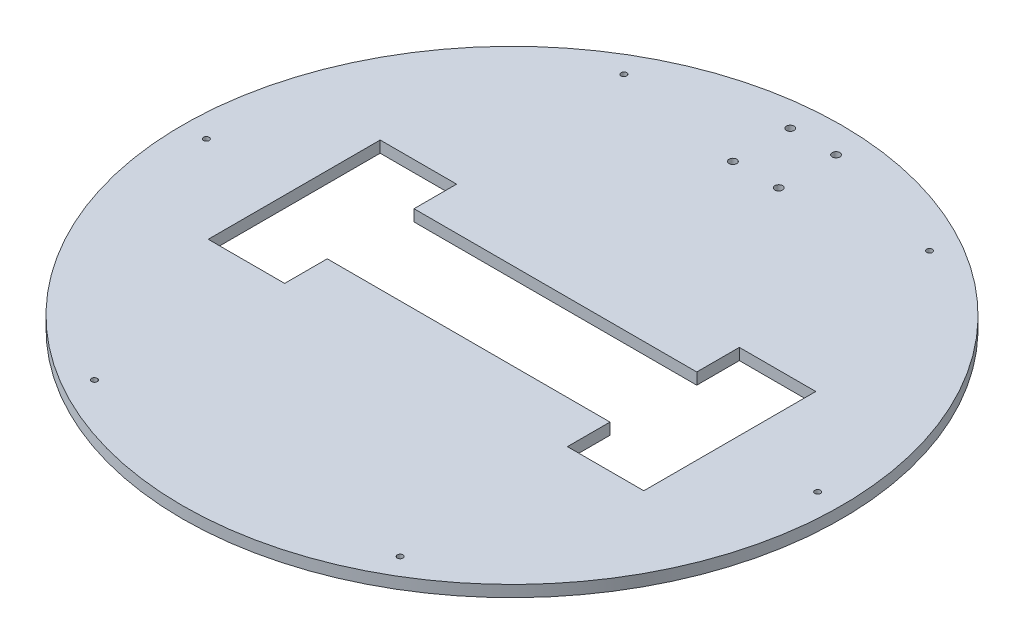
ISO-10303-21;
HEADER;
FILE_DESCRIPTION(('STEP AP214'),'2;1');
FILE_NAME('part.step','',(''),(''),'','','');
FILE_SCHEMA(('AUTOMOTIVE_DESIGN { 1 0 10303 214 1 1 1 1 }'));
ENDSEC;
DATA;
#1=APPLICATION_CONTEXT('core data for automotive mechanical design processes');
#2=APPLICATION_PROTOCOL_DEFINITION('international standard','automotive_design',2000,#1);
#3=PRODUCT_CONTEXT('',#1,'mechanical');
#4=PRODUCT('Part','Part','',(#3));
#5=PRODUCT_RELATED_PRODUCT_CATEGORY('part','',(#4));
#6=PRODUCT_DEFINITION_FORMATION('','',#4);
#7=PRODUCT_DEFINITION_CONTEXT('part definition',#1,'design');
#8=PRODUCT_DEFINITION('design','',#6,#7);
#9=PRODUCT_DEFINITION_SHAPE('','',#8);
#10=(LENGTH_UNIT() NAMED_UNIT(*) SI_UNIT(.MILLI.,.METRE.));
#11=(NAMED_UNIT(*) PLANE_ANGLE_UNIT() SI_UNIT($,.RADIAN.));
#12=(NAMED_UNIT(*) SI_UNIT($,.STERADIAN.) SOLID_ANGLE_UNIT());
#13=UNCERTAINTY_MEASURE_WITH_UNIT(LENGTH_MEASURE(1.E-05),#10,'distance_accuracy_value','');
#14=(GEOMETRIC_REPRESENTATION_CONTEXT(3) GLOBAL_UNCERTAINTY_ASSIGNED_CONTEXT((#13)) GLOBAL_UNIT_ASSIGNED_CONTEXT((#10,
#11,#12)) REPRESENTATION_CONTEXT('',''));
#15=CARTESIAN_POINT('',(0.,0.,0.));
#16=DIRECTION('',(0.,0.,1.));
#17=DIRECTION('',(1.,0.,0.));
#18=AXIS2_PLACEMENT_3D('',#15,#16,#17);
#19=CARTESIAN_POINT('',(0.,-6.,45.));
#20=DIRECTION('',(0.,0.,1.));
#21=DIRECTION('',(1.,0.,0.));
#22=AXIS2_PLACEMENT_3D('',#19,#20,#21);
#23=PLANE('',#22);
#24=DIRECTION('',(1.,0.,0.));
#25=VECTOR('',#24,1.);
#26=CARTESIAN_POINT('',(0.,0.,45.));
#27=LINE('',#26,#25);
#28=CARTESIAN_POINT('',(-114.,0.,45.));
#29=VERTEX_POINT('',#28);
#30=CARTESIAN_POINT('',(-74.,0.,45.));
#31=VERTEX_POINT('',#30);
#32=EDGE_CURVE('E195',#29,#31,#27,.T.);
#33=ORIENTED_EDGE('',*,*,#32,.T.);
#34=DIRECTION('',(0.,1.,0.));
#35=VECTOR('',#34,1.);
#36=CARTESIAN_POINT('',(-74.,-6.,45.));
#37=LINE('',#36,#35);
#38=CARTESIAN_POINT('',(-74.,-6.,45.));
#39=VERTEX_POINT('',#38);
#40=EDGE_CURVE('E11',#39,#31,#37,.T.);
#41=ORIENTED_EDGE('',*,*,#40,.F.);
#42=DIRECTION('',(1.,0.,0.));
#43=VECTOR('',#42,1.);
#44=CARTESIAN_POINT('',(0.,-6.,45.));
#45=LINE('',#44,#43);
#46=CARTESIAN_POINT('',(-114.,-6.,45.));
#47=VERTEX_POINT('',#46);
#48=EDGE_CURVE('E58',#47,#39,#45,.T.);
#49=ORIENTED_EDGE('',*,*,#48,.F.);
#50=DIRECTION('',(0.,1.,0.));
#51=VECTOR('',#50,1.);
#52=CARTESIAN_POINT('',(-114.,-6.,45.));
#53=LINE('',#52,#51);
#54=EDGE_CURVE('E43',#47,#29,#53,.T.);
#55=ORIENTED_EDGE('',*,*,#54,.T.);
#56=EDGE_LOOP('',(#33,#41,#49,#55));
#57=FACE_BOUND('',#56,.T.);
#58=ADVANCED_FACE('F39',(#57),#23,.F.);
#59=CARTESIAN_POINT('',(-74.,-6.,0.));
#60=DIRECTION('',(-1.,0.,0.));
#61=DIRECTION('',(0.,0.,1.));
#62=AXIS2_PLACEMENT_3D('',#59,#60,#61);
#63=PLANE('',#62);
#64=DIRECTION('',(0.,0.,1.));
#65=VECTOR('',#64,1.);
#66=CARTESIAN_POINT('',(-74.,0.,0.));
#67=LINE('',#66,#65);
#68=CARTESIAN_POINT('',(-74.,0.,22.705919102588));
#69=VERTEX_POINT('',#68);
#70=EDGE_CURVE('E222',#69,#31,#67,.T.);
#71=ORIENTED_EDGE('',*,*,#70,.F.);
#72=DIRECTION('',(0.,1.,0.));
#73=VECTOR('',#72,1.);
#74=CARTESIAN_POINT('',(-74.,-6.,22.705919102588));
#75=LINE('',#74,#73);
#76=CARTESIAN_POINT('',(-74.,-6.,22.705919102588));
#77=VERTEX_POINT('',#76);
#78=EDGE_CURVE('E49',#77,#69,#75,.T.);
#79=ORIENTED_EDGE('',*,*,#78,.F.);
#80=DIRECTION('',(0.,0.,1.));
#81=VECTOR('',#80,1.);
#82=CARTESIAN_POINT('',(-74.,-6.,0.));
#83=LINE('',#82,#81);
#84=EDGE_CURVE('E142',#77,#39,#83,.T.);
#85=ORIENTED_EDGE('',*,*,#84,.T.);
#86=ORIENTED_EDGE('',*,*,#40,.T.);
#87=EDGE_LOOP('',(#71,#79,#85,#86));
#88=FACE_BOUND('',#87,.T.);
#89=ADVANCED_FACE('F277',(#88),#63,.T.);
#90=CARTESIAN_POINT('',(0.,-6.,22.705919102588));
#91=DIRECTION('',(0.,0.,1.));
#92=DIRECTION('',(1.,0.,0.));
#93=AXIS2_PLACEMENT_3D('',#90,#91,#92);
#94=PLANE('',#93);
#95=DIRECTION('',(1.,0.,0.));
#96=VECTOR('',#95,1.);
#97=CARTESIAN_POINT('',(0.,0.,22.705919102588));
#98=LINE('',#97,#96);
#99=CARTESIAN_POINT('',(74.,0.,22.705919102588));
#100=VERTEX_POINT('',#99);
#101=EDGE_CURVE('E147',#69,#100,#98,.T.);
#102=ORIENTED_EDGE('',*,*,#101,.T.);
#103=DIRECTION('',(0.,1.,0.));
#104=VECTOR('',#103,1.);
#105=CARTESIAN_POINT('',(74.,-6.,22.705919102588));
#106=LINE('',#105,#104);
#107=CARTESIAN_POINT('',(74.,-6.,22.705919102588));
#108=VERTEX_POINT('',#107);
#109=EDGE_CURVE('E145',#108,#100,#106,.T.);
#110=ORIENTED_EDGE('',*,*,#109,.F.);
#111=DIRECTION('',(1.,0.,0.));
#112=VECTOR('',#111,1.);
#113=CARTESIAN_POINT('',(0.,-6.,22.705919102588));
#114=LINE('',#113,#112);
#115=EDGE_CURVE('E134',#77,#108,#114,.T.);
#116=ORIENTED_EDGE('',*,*,#115,.F.);
#117=ORIENTED_EDGE('',*,*,#78,.T.);
#118=EDGE_LOOP('',(#102,#110,#116,#117));
#119=FACE_BOUND('',#118,.T.);
#120=ADVANCED_FACE('F146',(#119),#94,.F.);
#121=CARTESIAN_POINT('',(74.,-6.,0.));
#122=DIRECTION('',(-1.,0.,0.));
#123=DIRECTION('',(0.,0.,1.));
#124=AXIS2_PLACEMENT_3D('',#121,#122,#123);
#125=PLANE('',#124);
#126=DIRECTION('',(0.,0.,1.));
#127=VECTOR('',#126,1.);
#128=CARTESIAN_POINT('',(74.,0.,0.));
#129=LINE('',#128,#127);
#130=CARTESIAN_POINT('',(74.,0.,45.));
#131=VERTEX_POINT('',#130);
#132=EDGE_CURVE('E219',#100,#131,#129,.T.);
#133=ORIENTED_EDGE('',*,*,#132,.T.);
#134=DIRECTION('',(0.,1.,0.));
#135=VECTOR('',#134,1.);
#136=CARTESIAN_POINT('',(74.,-6.,45.));
#137=LINE('',#136,#135);
#138=CARTESIAN_POINT('',(74.,-6.,45.));
#139=VERTEX_POINT('',#138);
#140=EDGE_CURVE('E151',#139,#131,#137,.T.);
#141=ORIENTED_EDGE('',*,*,#140,.F.);
#142=DIRECTION('',(0.,0.,1.));
#143=VECTOR('',#142,1.);
#144=CARTESIAN_POINT('',(74.,-6.,0.));
#145=LINE('',#144,#143);
#146=EDGE_CURVE('E140',#108,#139,#145,.T.);
#147=ORIENTED_EDGE('',*,*,#146,.F.);
#148=ORIENTED_EDGE('',*,*,#109,.T.);
#149=EDGE_LOOP('',(#133,#141,#147,#148));
#150=FACE_BOUND('',#149,.T.);
#151=ADVANCED_FACE('F153',(#150),#125,.F.);
#152=CARTESIAN_POINT('',(0.,-6.,45.));
#153=DIRECTION('',(0.,0.,-1.));
#154=DIRECTION('',(-1.,0.,0.));
#155=AXIS2_PLACEMENT_3D('',#152,#153,#154);
#156=PLANE('',#155);
#157=DIRECTION('',(-1.,0.,0.));
#158=VECTOR('',#157,1.);
#159=CARTESIAN_POINT('',(0.,0.,45.));
#160=LINE('',#159,#158);
#161=CARTESIAN_POINT('',(114.,0.,45.));
#162=VERTEX_POINT('',#161);
#163=EDGE_CURVE('E216',#162,#131,#160,.T.);
#164=ORIENTED_EDGE('',*,*,#163,.F.);
#165=DIRECTION('',(0.,1.,0.));
#166=VECTOR('',#165,1.);
#167=CARTESIAN_POINT('',(114.,-6.,45.));
#168=LINE('',#167,#166);
#169=CARTESIAN_POINT('',(114.,-6.,45.));
#170=VERTEX_POINT('',#169);
#171=EDGE_CURVE('E255',#170,#162,#168,.T.);
#172=ORIENTED_EDGE('',*,*,#171,.F.);
#173=DIRECTION('',(-1.,0.,0.));
#174=VECTOR('',#173,1.);
#175=CARTESIAN_POINT('',(0.,-6.,45.));
#176=LINE('',#175,#174);
#177=EDGE_CURVE('E155',#170,#139,#176,.T.);
#178=ORIENTED_EDGE('',*,*,#177,.T.);
#179=ORIENTED_EDGE('',*,*,#140,.T.);
#180=EDGE_LOOP('',(#164,#172,#178,#179));
#181=FACE_BOUND('',#180,.T.);
#182=ADVANCED_FACE('F292',(#181),#156,.T.);
#183=CARTESIAN_POINT('',(114.,-6.,0.));
#184=DIRECTION('',(-1.,0.,0.));
#185=DIRECTION('',(0.,0.,1.));
#186=AXIS2_PLACEMENT_3D('',#183,#184,#185);
#187=PLANE('',#186);
#188=DIRECTION('',(0.,0.,1.));
#189=VECTOR('',#188,1.);
#190=CARTESIAN_POINT('',(114.,0.,0.));
#191=LINE('',#190,#189);
#192=CARTESIAN_POINT('',(114.,0.,-45.));
#193=VERTEX_POINT('',#192);
#194=EDGE_CURVE('E213',#193,#162,#191,.T.);
#195=ORIENTED_EDGE('',*,*,#194,.F.);
#196=DIRECTION('',(0.,1.,0.));
#197=VECTOR('',#196,1.);
#198=CARTESIAN_POINT('',(114.,-6.,-45.));
#199=LINE('',#198,#197);
#200=CARTESIAN_POINT('',(114.,-6.,-45.));
#201=VERTEX_POINT('',#200);
#202=EDGE_CURVE('E257',#201,#193,#199,.T.);
#203=ORIENTED_EDGE('',*,*,#202,.F.);
#204=DIRECTION('',(0.,0.,1.));
#205=VECTOR('',#204,1.);
#206=CARTESIAN_POINT('',(114.,-6.,0.));
#207=LINE('',#206,#205);
#208=EDGE_CURVE('E157',#201,#170,#207,.T.);
#209=ORIENTED_EDGE('',*,*,#208,.T.);
#210=ORIENTED_EDGE('',*,*,#171,.T.);
#211=EDGE_LOOP('',(#195,#203,#209,#210));
#212=FACE_BOUND('',#211,.T.);
#213=ADVANCED_FACE('F295',(#212),#187,.T.);
#214=CARTESIAN_POINT('',(0.,-6.,-45.));
#215=DIRECTION('',(0.,0.,-1.));
#216=DIRECTION('',(-1.,0.,0.));
#217=AXIS2_PLACEMENT_3D('',#214,#215,#216);
#218=PLANE('',#217);
#219=DIRECTION('',(-1.,0.,0.));
#220=VECTOR('',#219,1.);
#221=CARTESIAN_POINT('',(0.,0.,-45.));
#222=LINE('',#221,#220);
#223=CARTESIAN_POINT('',(74.,0.,-45.));
#224=VERTEX_POINT('',#223);
#225=EDGE_CURVE('E211',#193,#224,#222,.T.);
#226=ORIENTED_EDGE('',*,*,#225,.T.);
#227=DIRECTION('',(0.,1.,0.));
#228=VECTOR('',#227,1.);
#229=CARTESIAN_POINT('',(74.,-6.,-45.));
#230=LINE('',#229,#228);
#231=CARTESIAN_POINT('',(74.,-6.,-45.));
#232=VERTEX_POINT('',#231);
#233=EDGE_CURVE('E259',#232,#224,#230,.T.);
#234=ORIENTED_EDGE('',*,*,#233,.F.);
#235=DIRECTION('',(-1.,0.,0.));
#236=VECTOR('',#235,1.);
#237=CARTESIAN_POINT('',(0.,-6.,-45.));
#238=LINE('',#237,#236);
#239=EDGE_CURVE('E590',#201,#232,#238,.T.);
#240=ORIENTED_EDGE('',*,*,#239,.F.);
#241=ORIENTED_EDGE('',*,*,#202,.T.);
#242=EDGE_LOOP('',(#226,#234,#240,#241));
#243=FACE_BOUND('',#242,.T.);
#244=ADVANCED_FACE('F299',(#243),#218,.F.);
#245=CARTESIAN_POINT('',(74.,-6.,0.));
#246=DIRECTION('',(-1.,0.,0.));
#247=DIRECTION('',(0.,0.,1.));
#248=AXIS2_PLACEMENT_3D('',#245,#246,#247);
#249=PLANE('',#248);
#250=DIRECTION('',(0.,0.,1.));
#251=VECTOR('',#250,1.);
#252=CARTESIAN_POINT('',(74.,0.,0.));
#253=LINE('',#252,#251);
#254=CARTESIAN_POINT('',(74.,0.,-22.705919102588));
#255=VERTEX_POINT('',#254);
#256=EDGE_CURVE('E208',#224,#255,#253,.T.);
#257=ORIENTED_EDGE('',*,*,#256,.T.);
#258=DIRECTION('',(0.,1.,0.));
#259=VECTOR('',#258,1.);
#260=CARTESIAN_POINT('',(74.,-6.,-22.705919102588));
#261=LINE('',#260,#259);
#262=CARTESIAN_POINT('',(74.,-6.,-22.705919102588));
#263=VERTEX_POINT('',#262);
#264=EDGE_CURVE('E262',#263,#255,#261,.T.);
#265=ORIENTED_EDGE('',*,*,#264,.F.);
#266=DIRECTION('',(0.,0.,1.));
#267=VECTOR('',#266,1.);
#268=CARTESIAN_POINT('',(74.,-6.,0.));
#269=LINE('',#268,#267);
#270=EDGE_CURVE('E588',#232,#263,#269,.T.);
#271=ORIENTED_EDGE('',*,*,#270,.F.);
#272=ORIENTED_EDGE('',*,*,#233,.T.);
#273=EDGE_LOOP('',(#257,#265,#271,#272));
#274=FACE_BOUND('',#273,.T.);
#275=ADVANCED_FACE('F303',(#274),#249,.F.);
#276=CARTESIAN_POINT('',(0.,-6.,-22.705919102588));
#277=DIRECTION('',(0.,0.,1.));
#278=DIRECTION('',(1.,0.,0.));
#279=AXIS2_PLACEMENT_3D('',#276,#277,#278);
#280=PLANE('',#279);
#281=DIRECTION('',(1.,0.,0.));
#282=VECTOR('',#281,1.);
#283=CARTESIAN_POINT('',(0.,0.,-22.705919102588));
#284=LINE('',#283,#282);
#285=CARTESIAN_POINT('',(-74.,0.,-22.705919102588));
#286=VERTEX_POINT('',#285);
#287=EDGE_CURVE('E205',#286,#255,#284,.T.);
#288=ORIENTED_EDGE('',*,*,#287,.F.);
#289=DIRECTION('',(0.,1.,0.));
#290=VECTOR('',#289,1.);
#291=CARTESIAN_POINT('',(-74.,-6.,-22.705919102588));
#292=LINE('',#291,#290);
#293=CARTESIAN_POINT('',(-74.,-6.,-22.705919102588));
#294=VERTEX_POINT('',#293);
#295=EDGE_CURVE('E264',#294,#286,#292,.T.);
#296=ORIENTED_EDGE('',*,*,#295,.F.);
#297=DIRECTION('',(1.,0.,0.));
#298=VECTOR('',#297,1.);
#299=CARTESIAN_POINT('',(0.,-6.,-22.705919102588));
#300=LINE('',#299,#298);
#301=EDGE_CURVE('E585',#294,#263,#300,.T.);
#302=ORIENTED_EDGE('',*,*,#301,.T.);
#303=ORIENTED_EDGE('',*,*,#264,.T.);
#304=EDGE_LOOP('',(#288,#296,#302,#303));
#305=FACE_BOUND('',#304,.T.);
#306=ADVANCED_FACE('F307',(#305),#280,.T.);
#307=CARTESIAN_POINT('',(-74.,-6.,0.));
#308=DIRECTION('',(-1.,0.,0.));
#309=DIRECTION('',(0.,0.,1.));
#310=AXIS2_PLACEMENT_3D('',#307,#308,#309);
#311=PLANE('',#310);
#312=DIRECTION('',(0.,0.,1.));
#313=VECTOR('',#312,1.);
#314=CARTESIAN_POINT('',(-74.,0.,0.));
#315=LINE('',#314,#313);
#316=CARTESIAN_POINT('',(-74.,0.,-45.));
#317=VERTEX_POINT('',#316);
#318=EDGE_CURVE('E202',#317,#286,#315,.T.);
#319=ORIENTED_EDGE('',*,*,#318,.F.);
#320=DIRECTION('',(0.,1.,0.));
#321=VECTOR('',#320,1.);
#322=CARTESIAN_POINT('',(-74.,-6.,-45.));
#323=LINE('',#322,#321);
#324=CARTESIAN_POINT('',(-74.,-6.,-45.));
#325=VERTEX_POINT('',#324);
#326=EDGE_CURVE('E266',#325,#317,#323,.T.);
#327=ORIENTED_EDGE('',*,*,#326,.F.);
#328=DIRECTION('',(0.,0.,1.));
#329=VECTOR('',#328,1.);
#330=CARTESIAN_POINT('',(-74.,-6.,0.));
#331=LINE('',#330,#329);
#332=EDGE_CURVE('E582',#325,#294,#331,.T.);
#333=ORIENTED_EDGE('',*,*,#332,.T.);
#334=ORIENTED_EDGE('',*,*,#295,.T.);
#335=EDGE_LOOP('',(#319,#327,#333,#334));
#336=FACE_BOUND('',#335,.T.);
#337=ADVANCED_FACE('F311',(#336),#311,.T.);
#338=CARTESIAN_POINT('',(0.,-6.,-45.));
#339=DIRECTION('',(0.,0.,1.));
#340=DIRECTION('',(1.,0.,0.));
#341=AXIS2_PLACEMENT_3D('',#338,#339,#340);
#342=PLANE('',#341);
#343=DIRECTION('',(1.,0.,0.));
#344=VECTOR('',#343,1.);
#345=CARTESIAN_POINT('',(0.,0.,-45.));
#346=LINE('',#345,#344);
#347=CARTESIAN_POINT('',(-114.,0.,-45.));
#348=VERTEX_POINT('',#347);
#349=EDGE_CURVE('E199',#348,#317,#346,.T.);
#350=ORIENTED_EDGE('',*,*,#349,.F.);
#351=DIRECTION('',(0.,1.,0.));
#352=VECTOR('',#351,1.);
#353=CARTESIAN_POINT('',(-114.,-6.,-45.));
#354=LINE('',#353,#352);
#355=CARTESIAN_POINT('',(-114.,-6.,-45.));
#356=VERTEX_POINT('',#355);
#357=EDGE_CURVE('E267',#356,#348,#354,.T.);
#358=ORIENTED_EDGE('',*,*,#357,.F.);
#359=DIRECTION('',(1.,0.,0.));
#360=VECTOR('',#359,1.);
#361=CARTESIAN_POINT('',(0.,-6.,-45.));
#362=LINE('',#361,#360);
#363=EDGE_CURVE('E579',#356,#325,#362,.T.);
#364=ORIENTED_EDGE('',*,*,#363,.T.);
#365=ORIENTED_EDGE('',*,*,#326,.T.);
#366=EDGE_LOOP('',(#350,#358,#364,#365));
#367=FACE_BOUND('',#366,.T.);
#368=ADVANCED_FACE('F315',(#367),#342,.T.);
#369=CARTESIAN_POINT('',(-80.0000000000016,-6.,138.564064605509));
#370=DIRECTION('',(0.,1.,0.));
#371=DIRECTION('',(0.,0.,1.));
#372=AXIS2_PLACEMENT_3D('',#369,#370,#371);
#373=CYLINDRICAL_SURFACE('',#372,1.5);
#374=CARTESIAN_POINT('',(-80.0000000000016,-6.,138.564064605509));
#375=DIRECTION('',(0.,1.,0.));
#376=DIRECTION('',(0.,0.,1.));
#377=AXIS2_PLACEMENT_3D('',#374,#375,#376);
#378=CIRCLE('',#377,1.5);
#379=CARTESIAN_POINT('',(-80.0000000000016,-6.,140.064064605509));
#380=VERTEX_POINT('',#379);
#381=EDGE_CURVE('E183',#380,#380,#378,.T.);
#382=ORIENTED_EDGE('',*,*,#381,.F.);
#383=EDGE_LOOP('',(#382));
#384=FACE_BOUND('',#383,.T.);
#385=CARTESIAN_POINT('',(-80.0000000000016,0.,138.564064605509));
#386=DIRECTION('',(0.,1.,0.));
#387=DIRECTION('',(0.,0.,1.));
#388=AXIS2_PLACEMENT_3D('',#385,#386,#387);
#389=CIRCLE('',#388,1.5);
#390=CARTESIAN_POINT('',(-80.0000000000016,0.,140.064064605509));
#391=VERTEX_POINT('',#390);
#392=EDGE_CURVE('E246',#391,#391,#389,.T.);
#393=ORIENTED_EDGE('',*,*,#392,.T.);
#394=EDGE_LOOP('',(#393));
#395=FACE_BOUND('',#394,.T.);
#396=ADVANCED_FACE('F319',(#384,#395),#373,.F.);
#397=CARTESIAN_POINT('',(12.,-6.,-157.620399327377));
#398=DIRECTION('',(0.,1.,0.));
#399=DIRECTION('',(0.,0.,1.));
#400=AXIS2_PLACEMENT_3D('',#397,#398,#399);
#401=CYLINDRICAL_SURFACE('',#400,2.01300051475852);
#402=CARTESIAN_POINT('',(12.,-6.,-157.620399327377));
#403=DIRECTION('',(0.,1.,0.));
#404=DIRECTION('',(0.,0.,1.));
#405=AXIS2_PLACEMENT_3D('',#402,#403,#404);
#406=CIRCLE('',#405,2.01300051475852);
#407=CARTESIAN_POINT('',(12.,-6.,-155.607398812619));
#408=VERTEX_POINT('',#407);
#409=EDGE_CURVE('E180',#408,#408,#406,.T.);
#410=ORIENTED_EDGE('',*,*,#409,.F.);
#411=EDGE_LOOP('',(#410));
#412=FACE_BOUND('',#411,.T.);
#413=CARTESIAN_POINT('',(12.,0.,-157.620399327377));
#414=DIRECTION('',(0.,1.,0.));
#415=DIRECTION('',(0.,0.,1.));
#416=AXIS2_PLACEMENT_3D('',#413,#414,#415);
#417=CIRCLE('',#416,2.01300051475852);
#418=CARTESIAN_POINT('',(12.,0.,-155.607398812619));
#419=VERTEX_POINT('',#418);
#420=EDGE_CURVE('E243',#419,#419,#417,.T.);
#421=ORIENTED_EDGE('',*,*,#420,.T.);
#422=EDGE_LOOP('',(#421));
#423=FACE_BOUND('',#422,.T.);
#424=ADVANCED_FACE('F351',(#412,#423),#401,.F.);
#425=CARTESIAN_POINT('',(-12.,-6.,-157.620399327377));
#426=DIRECTION('',(0.,1.,0.));
#427=DIRECTION('',(0.,0.,1.));
#428=AXIS2_PLACEMENT_3D('',#425,#426,#427);
#429=CYLINDRICAL_SURFACE('',#428,2.01300051475852);
#430=CARTESIAN_POINT('',(-12.,-6.,-157.620399327377));
#431=DIRECTION('',(0.,1.,0.));
#432=DIRECTION('',(0.,0.,1.));
#433=AXIS2_PLACEMENT_3D('',#430,#431,#432);
#434=CIRCLE('',#433,2.01300051475852);
#435=CARTESIAN_POINT('',(-12.,-6.,-155.607398812619));
#436=VERTEX_POINT('',#435);
#437=EDGE_CURVE('E177',#436,#436,#434,.T.);
#438=ORIENTED_EDGE('',*,*,#437,.F.);
#439=EDGE_LOOP('',(#438));
#440=FACE_BOUND('',#439,.T.);
#441=CARTESIAN_POINT('',(-12.,0.,-157.620399327377));
#442=DIRECTION('',(0.,1.,0.));
#443=DIRECTION('',(0.,0.,1.));
#444=AXIS2_PLACEMENT_3D('',#441,#442,#443);
#445=CIRCLE('',#444,2.01300051475852);
#446=CARTESIAN_POINT('',(-12.,0.,-155.607398812619));
#447=VERTEX_POINT('',#446);
#448=EDGE_CURVE('E240',#447,#447,#445,.T.);
#449=ORIENTED_EDGE('',*,*,#448,.T.);
#450=EDGE_LOOP('',(#449));
#451=FACE_BOUND('',#450,.T.);
#452=ADVANCED_FACE('F355',(#440,#451),#429,.F.);
#453=CARTESIAN_POINT('',(-12.,-6.,-127.620399327377));
#454=DIRECTION('',(0.,1.,0.));
#455=DIRECTION('',(0.,0.,1.));
#456=AXIS2_PLACEMENT_3D('',#453,#454,#455);
#457=CYLINDRICAL_SURFACE('',#456,2.01300051475852);
#458=CARTESIAN_POINT('',(-12.,-6.,-127.620399327377));
#459=DIRECTION('',(0.,1.,0.));
#460=DIRECTION('',(0.,0.,1.));
#461=AXIS2_PLACEMENT_3D('',#458,#459,#460);
#462=CIRCLE('',#461,2.01300051475852);
#463=CARTESIAN_POINT('',(-12.,-6.,-125.607398812619));
#464=VERTEX_POINT('',#463);
#465=EDGE_CURVE('E174',#464,#464,#462,.T.);
#466=ORIENTED_EDGE('',*,*,#465,.F.);
#467=EDGE_LOOP('',(#466));
#468=FACE_BOUND('',#467,.T.);
#469=CARTESIAN_POINT('',(-12.,0.,-127.620399327377));
#470=DIRECTION('',(0.,1.,0.));
#471=DIRECTION('',(0.,0.,1.));
#472=AXIS2_PLACEMENT_3D('',#469,#470,#471);
#473=CIRCLE('',#472,2.01300051475852);
#474=CARTESIAN_POINT('',(-12.,0.,-125.607398812619));
#475=VERTEX_POINT('',#474);
#476=EDGE_CURVE('E237',#475,#475,#473,.T.);
#477=ORIENTED_EDGE('',*,*,#476,.T.);
#478=EDGE_LOOP('',(#477));
#479=FACE_BOUND('',#478,.T.);
#480=ADVANCED_FACE('F359',(#468,#479),#457,.F.);
#481=CARTESIAN_POINT('',(12.,-6.,-127.620399327377));
#482=DIRECTION('',(0.,1.,0.));
#483=DIRECTION('',(0.,0.,1.));
#484=AXIS2_PLACEMENT_3D('',#481,#482,#483);
#485=CYLINDRICAL_SURFACE('',#484,2.01300051475852);
#486=CARTESIAN_POINT('',(12.,-6.,-127.620399327377));
#487=DIRECTION('',(0.,1.,0.));
#488=DIRECTION('',(0.,0.,1.));
#489=AXIS2_PLACEMENT_3D('',#486,#487,#488);
#490=CIRCLE('',#489,2.01300051475852);
#491=CARTESIAN_POINT('',(12.,-6.,-125.607398812619));
#492=VERTEX_POINT('',#491);
#493=EDGE_CURVE('E171',#492,#492,#490,.T.);
#494=ORIENTED_EDGE('',*,*,#493,.F.);
#495=EDGE_LOOP('',(#494));
#496=FACE_BOUND('',#495,.T.);
#497=CARTESIAN_POINT('',(12.,0.,-127.620399327377));
#498=DIRECTION('',(0.,1.,0.));
#499=DIRECTION('',(0.,0.,1.));
#500=AXIS2_PLACEMENT_3D('',#497,#498,#499);
#501=CIRCLE('',#500,2.01300051475852);
#502=CARTESIAN_POINT('',(12.,0.,-125.607398812619));
#503=VERTEX_POINT('',#502);
#504=EDGE_CURVE('E234',#503,#503,#501,.T.);
#505=ORIENTED_EDGE('',*,*,#504,.T.);
#506=EDGE_LOOP('',(#505));
#507=FACE_BOUND('',#506,.T.);
#508=ADVANCED_FACE('F363',(#496,#507),#485,.F.);
#509=CARTESIAN_POINT('',(-79.9999999999997,-6.,-138.56406460551));
#510=DIRECTION('',(0.,1.,0.));
#511=DIRECTION('',(0.,0.,1.));
#512=AXIS2_PLACEMENT_3D('',#509,#510,#511);
#513=CYLINDRICAL_SURFACE('',#512,1.5);
#514=CARTESIAN_POINT('',(-79.9999999999997,-6.,-138.56406460551));
#515=DIRECTION('',(0.,1.,0.));
#516=DIRECTION('',(0.,0.,1.));
#517=AXIS2_PLACEMENT_3D('',#514,#515,#516);
#518=CIRCLE('',#517,1.5);
#519=CARTESIAN_POINT('',(-79.9999999999997,-6.,-137.06406460551));
#520=VERTEX_POINT('',#519);
#521=EDGE_CURVE('E168',#520,#520,#518,.T.);
#522=ORIENTED_EDGE('',*,*,#521,.F.);
#523=EDGE_LOOP('',(#522));
#524=FACE_BOUND('',#523,.T.);
#525=CARTESIAN_POINT('',(-79.9999999999997,0.,-138.56406460551));
#526=DIRECTION('',(0.,1.,0.));
#527=DIRECTION('',(0.,0.,1.));
#528=AXIS2_PLACEMENT_3D('',#525,#526,#527);
#529=CIRCLE('',#528,1.5);
#530=CARTESIAN_POINT('',(-79.9999999999997,0.,-137.06406460551));
#531=VERTEX_POINT('',#530);
#532=EDGE_CURVE('E231',#531,#531,#529,.T.);
#533=ORIENTED_EDGE('',*,*,#532,.T.);
#534=EDGE_LOOP('',(#533));
#535=FACE_BOUND('',#534,.T.);
#536=ADVANCED_FACE('F367',(#524,#535),#513,.F.);
#537=CARTESIAN_POINT('',(80.0000000000006,-6.,-138.56406460551));
#538=DIRECTION('',(0.,1.,0.));
#539=DIRECTION('',(0.,0.,1.));
#540=AXIS2_PLACEMENT_3D('',#537,#538,#539);
#541=CYLINDRICAL_SURFACE('',#540,1.5);
#542=CARTESIAN_POINT('',(80.0000000000006,-6.,-138.56406460551));
#543=DIRECTION('',(0.,1.,0.));
#544=DIRECTION('',(0.,0.,1.));
#545=AXIS2_PLACEMENT_3D('',#542,#543,#544);
#546=CIRCLE('',#545,1.5);
#547=CARTESIAN_POINT('',(80.0000000000006,-6.,-137.06406460551));
#548=VERTEX_POINT('',#547);
#549=EDGE_CURVE('E165',#548,#548,#546,.T.);
#550=ORIENTED_EDGE('',*,*,#549,.F.);
#551=EDGE_LOOP('',(#550));
#552=FACE_BOUND('',#551,.T.);
#553=CARTESIAN_POINT('',(80.0000000000006,0.,-138.56406460551));
#554=DIRECTION('',(0.,1.,0.));
#555=DIRECTION('',(0.,0.,1.));
#556=AXIS2_PLACEMENT_3D('',#553,#554,#555);
#557=CIRCLE('',#556,1.5);
#558=CARTESIAN_POINT('',(80.0000000000006,0.,-137.06406460551));
#559=VERTEX_POINT('',#558);
#560=EDGE_CURVE('E228',#559,#559,#557,.T.);
#561=ORIENTED_EDGE('',*,*,#560,.T.);
#562=EDGE_LOOP('',(#561));
#563=FACE_BOUND('',#562,.T.);
#564=ADVANCED_FACE('F370',(#552,#563),#541,.F.);
#565=CARTESIAN_POINT('',(160.,-6.,1.1172740284298E-12));
#566=DIRECTION('',(0.,1.,0.));
#567=DIRECTION('',(0.,0.,1.));
#568=AXIS2_PLACEMENT_3D('',#565,#566,#567);
#569=CYLINDRICAL_SURFACE('',#568,1.49999999999999);
#570=CARTESIAN_POINT('',(160.,-6.,1.1172740284298E-12));
#571=DIRECTION('',(0.,1.,0.));
#572=DIRECTION('',(0.,0.,1.));
#573=AXIS2_PLACEMENT_3D('',#570,#571,#572);
#574=CIRCLE('',#573,1.49999999999999);
#575=CARTESIAN_POINT('',(160.,-6.,1.50000000000111));
#576=VERTEX_POINT('',#575);
#577=EDGE_CURVE('E162',#576,#576,#574,.T.);
#578=ORIENTED_EDGE('',*,*,#577,.F.);
#579=EDGE_LOOP('',(#578));
#580=FACE_BOUND('',#579,.T.);
#581=CARTESIAN_POINT('',(160.,0.,1.1172740284298E-12));
#582=DIRECTION('',(0.,1.,0.));
#583=DIRECTION('',(0.,0.,1.));
#584=AXIS2_PLACEMENT_3D('',#581,#582,#583);
#585=CIRCLE('',#584,1.49999999999999);
#586=CARTESIAN_POINT('',(160.,0.,1.50000000000111));
#587=VERTEX_POINT('',#586);
#588=EDGE_CURVE('E225',#587,#587,#585,.T.);
#589=ORIENTED_EDGE('',*,*,#588,.T.);
#590=EDGE_LOOP('',(#589));
#591=FACE_BOUND('',#590,.T.);
#592=ADVANCED_FACE('F287',(#580,#591),#569,.F.);
#593=CARTESIAN_POINT('',(-114.,-6.,0.));
#594=DIRECTION('',(-1.,0.,0.));
#595=DIRECTION('',(0.,0.,1.));
#596=AXIS2_PLACEMENT_3D('',#593,#594,#595);
#597=PLANE('',#596);
#598=DIRECTION('',(0.,0.,1.));
#599=VECTOR('',#598,1.);
#600=CARTESIAN_POINT('',(-114.,0.,0.));
#601=LINE('',#600,#599);
#602=EDGE_CURVE('E197',#348,#29,#601,.T.);
#603=ORIENTED_EDGE('',*,*,#602,.T.);
#604=ORIENTED_EDGE('',*,*,#54,.F.);
#605=DIRECTION('',(0.,0.,1.));
#606=VECTOR('',#605,1.);
#607=CARTESIAN_POINT('',(-114.,-6.,0.));
#608=LINE('',#607,#606);
#609=EDGE_CURVE('E108',#356,#47,#608,.T.);
#610=ORIENTED_EDGE('',*,*,#609,.F.);
#611=ORIENTED_EDGE('',*,*,#357,.T.);
#612=EDGE_LOOP('',(#603,#604,#610,#611));
#613=FACE_BOUND('',#612,.T.);
#614=ADVANCED_FACE('F321',(#613),#597,.F.);
#615=CARTESIAN_POINT('',(-160.,-6.,0.));
#616=DIRECTION('',(0.,1.,0.));
#617=DIRECTION('',(0.,0.,1.));
#618=AXIS2_PLACEMENT_3D('',#615,#616,#617);
#619=CYLINDRICAL_SURFACE('',#618,1.5);
#620=CARTESIAN_POINT('',(-160.,-6.,0.));
#621=DIRECTION('',(0.,1.,0.));
#622=DIRECTION('',(0.,0.,1.));
#623=AXIS2_PLACEMENT_3D('',#620,#621,#622);
#624=CIRCLE('',#623,1.5);
#625=CARTESIAN_POINT('',(-160.,-6.,1.5));
#626=VERTEX_POINT('',#625);
#627=EDGE_CURVE('E334',#626,#626,#624,.T.);
#628=ORIENTED_EDGE('',*,*,#627,.F.);
#629=EDGE_LOOP('',(#628));
#630=FACE_BOUND('',#629,.T.);
#631=CARTESIAN_POINT('',(-160.,0.,0.));
#632=DIRECTION('',(0.,1.,0.));
#633=DIRECTION('',(0.,0.,1.));
#634=AXIS2_PLACEMENT_3D('',#631,#632,#633);
#635=CIRCLE('',#634,1.5);
#636=CARTESIAN_POINT('',(-160.,0.,1.5));
#637=VERTEX_POINT('',#636);
#638=EDGE_CURVE('E192',#637,#637,#635,.T.);
#639=ORIENTED_EDGE('',*,*,#638,.T.);
#640=EDGE_LOOP('',(#639));
#641=FACE_BOUND('',#640,.T.);
#642=ADVANCED_FACE('F323',(#630,#641),#619,.F.);
#643=CARTESIAN_POINT('',(0.,-6.,0.));
#644=DIRECTION('',(0.,1.,0.));
#645=DIRECTION('',(0.,0.,1.));
#646=AXIS2_PLACEMENT_3D('',#643,#644,#645);
#647=CYLINDRICAL_SURFACE('',#646,172.5);
#648=CARTESIAN_POINT('',(0.,-6.,0.));
#649=DIRECTION('',(0.,1.,0.));
#650=DIRECTION('',(0.,0.,1.));
#651=AXIS2_PLACEMENT_3D('',#648,#649,#650);
#652=CIRCLE('',#651,172.5);
#653=CARTESIAN_POINT('',(0.,-6.,172.5));
#654=VERTEX_POINT('',#653);
#655=EDGE_CURVE('E251',#654,#654,#652,.T.);
#656=ORIENTED_EDGE('',*,*,#655,.T.);
#657=EDGE_LOOP('',(#656));
#658=FACE_BOUND('',#657,.T.);
#659=CARTESIAN_POINT('',(0.,0.,0.));
#660=DIRECTION('',(0.,1.,0.));
#661=DIRECTION('',(0.,0.,1.));
#662=AXIS2_PLACEMENT_3D('',#659,#660,#661);
#663=CIRCLE('',#662,172.5);
#664=CARTESIAN_POINT('',(0.,0.,172.5));
#665=VERTEX_POINT('',#664);
#666=EDGE_CURVE('E189',#665,#665,#663,.T.);
#667=ORIENTED_EDGE('',*,*,#666,.F.);
#668=EDGE_LOOP('',(#667));
#669=FACE_BOUND('',#668,.T.);
#670=ADVANCED_FACE('F41',(#658,#669),#647,.T.);
#671=CARTESIAN_POINT('',(79.9999999999987,-6.,138.564064605511));
#672=DIRECTION('',(0.,1.,0.));
#673=DIRECTION('',(0.,0.,1.));
#674=AXIS2_PLACEMENT_3D('',#671,#672,#673);
#675=CYLINDRICAL_SURFACE('',#674,1.50000000000001);
#676=CARTESIAN_POINT('',(79.9999999999987,-6.,138.564064605511));
#677=DIRECTION('',(0.,1.,0.));
#678=DIRECTION('',(0.,0.,1.));
#679=AXIS2_PLACEMENT_3D('',#676,#677,#678);
#680=CIRCLE('',#679,1.50000000000001);
#681=CARTESIAN_POINT('',(79.9999999999987,-6.,140.064064605511));
#682=VERTEX_POINT('',#681);
#683=EDGE_CURVE('E186',#682,#682,#680,.T.);
#684=ORIENTED_EDGE('',*,*,#683,.F.);
#685=EDGE_LOOP('',(#684));
#686=FACE_BOUND('',#685,.T.);
#687=CARTESIAN_POINT('',(79.9999999999987,0.,138.564064605511));
#688=DIRECTION('',(0.,1.,0.));
#689=DIRECTION('',(0.,0.,1.));
#690=AXIS2_PLACEMENT_3D('',#687,#688,#689);
#691=CIRCLE('',#690,1.50000000000001);
#692=CARTESIAN_POINT('',(79.9999999999987,0.,140.064064605511));
#693=VERTEX_POINT('',#692);
#694=EDGE_CURVE('E249',#693,#693,#691,.T.);
#695=ORIENTED_EDGE('',*,*,#694,.T.);
#696=EDGE_LOOP('',(#695));
#697=FACE_BOUND('',#696,.T.);
#698=ADVANCED_FACE('F329',(#686,#697),#675,.F.);
#699=CARTESIAN_POINT('',(0.,-6.,0.));
#700=DIRECTION('',(0.,1.,0.));
#701=DIRECTION('',(0.,0.,1.));
#702=AXIS2_PLACEMENT_3D('',#699,#700,#701);
#703=PLANE('',#702);
#704=ORIENTED_EDGE('',*,*,#655,.F.);
#705=EDGE_LOOP('',(#704));
#706=FACE_BOUND('',#705,.T.);
#707=ORIENTED_EDGE('',*,*,#627,.T.);
#708=EDGE_LOOP('',(#707));
#709=FACE_BOUND('',#708,.T.);
#710=ORIENTED_EDGE('',*,*,#48,.T.);
#711=ORIENTED_EDGE('',*,*,#84,.F.);
#712=ORIENTED_EDGE('',*,*,#115,.T.);
#713=ORIENTED_EDGE('',*,*,#146,.T.);
#714=ORIENTED_EDGE('',*,*,#177,.F.);
#715=ORIENTED_EDGE('',*,*,#208,.F.);
#716=ORIENTED_EDGE('',*,*,#239,.T.);
#717=ORIENTED_EDGE('',*,*,#270,.T.);
#718=ORIENTED_EDGE('',*,*,#301,.F.);
#719=ORIENTED_EDGE('',*,*,#332,.F.);
#720=ORIENTED_EDGE('',*,*,#363,.F.);
#721=ORIENTED_EDGE('',*,*,#609,.T.);
#722=EDGE_LOOP('',(#710,#711,#712,#713,#714,#715,#716,#717,#718,#719,#720,#721));
#723=FACE_BOUND('',#722,.T.);
#724=ORIENTED_EDGE('',*,*,#577,.T.);
#725=EDGE_LOOP('',(#724));
#726=FACE_BOUND('',#725,.T.);
#727=ORIENTED_EDGE('',*,*,#549,.T.);
#728=EDGE_LOOP('',(#727));
#729=FACE_BOUND('',#728,.T.);
#730=ORIENTED_EDGE('',*,*,#521,.T.);
#731=EDGE_LOOP('',(#730));
#732=FACE_BOUND('',#731,.T.);
#733=ORIENTED_EDGE('',*,*,#493,.T.);
#734=EDGE_LOOP('',(#733));
#735=FACE_BOUND('',#734,.T.);
#736=ORIENTED_EDGE('',*,*,#465,.T.);
#737=EDGE_LOOP('',(#736));
#738=FACE_BOUND('',#737,.T.);
#739=ORIENTED_EDGE('',*,*,#437,.T.);
#740=EDGE_LOOP('',(#739));
#741=FACE_BOUND('',#740,.T.);
#742=ORIENTED_EDGE('',*,*,#409,.T.);
#743=EDGE_LOOP('',(#742));
#744=FACE_BOUND('',#743,.T.);
#745=ORIENTED_EDGE('',*,*,#381,.T.);
#746=EDGE_LOOP('',(#745));
#747=FACE_BOUND('',#746,.T.);
#748=ORIENTED_EDGE('',*,*,#683,.T.);
#749=EDGE_LOOP('',(#748));
#750=FACE_BOUND('',#749,.T.);
#751=ADVANCED_FACE('F136',(#706,#709,#723,#726,#729,#732,#735,#738,#741,#744,#747,#750),#703,.F.);
#752=CARTESIAN_POINT('',(0.,0.,0.));
#753=DIRECTION('',(0.,1.,0.));
#754=DIRECTION('',(0.,0.,1.));
#755=AXIS2_PLACEMENT_3D('',#752,#753,#754);
#756=PLANE('',#755);
#757=ORIENTED_EDGE('',*,*,#666,.T.);
#758=EDGE_LOOP('',(#757));
#759=FACE_BOUND('',#758,.T.);
#760=ORIENTED_EDGE('',*,*,#638,.F.);
#761=EDGE_LOOP('',(#760));
#762=FACE_BOUND('',#761,.T.);
#763=ORIENTED_EDGE('',*,*,#32,.F.);
#764=ORIENTED_EDGE('',*,*,#602,.F.);
#765=ORIENTED_EDGE('',*,*,#349,.T.);
#766=ORIENTED_EDGE('',*,*,#318,.T.);
#767=ORIENTED_EDGE('',*,*,#287,.T.);
#768=ORIENTED_EDGE('',*,*,#256,.F.);
#769=ORIENTED_EDGE('',*,*,#225,.F.);
#770=ORIENTED_EDGE('',*,*,#194,.T.);
#771=ORIENTED_EDGE('',*,*,#163,.T.);
#772=ORIENTED_EDGE('',*,*,#132,.F.);
#773=ORIENTED_EDGE('',*,*,#101,.F.);
#774=ORIENTED_EDGE('',*,*,#70,.T.);
#775=EDGE_LOOP('',(#763,#764,#765,#766,#767,#768,#769,#770,#771,#772,#773,#774));
#776=FACE_BOUND('',#775,.T.);
#777=ORIENTED_EDGE('',*,*,#588,.F.);
#778=EDGE_LOOP('',(#777));
#779=FACE_BOUND('',#778,.T.);
#780=ORIENTED_EDGE('',*,*,#560,.F.);
#781=EDGE_LOOP('',(#780));
#782=FACE_BOUND('',#781,.T.);
#783=ORIENTED_EDGE('',*,*,#532,.F.);
#784=EDGE_LOOP('',(#783));
#785=FACE_BOUND('',#784,.T.);
#786=ORIENTED_EDGE('',*,*,#504,.F.);
#787=EDGE_LOOP('',(#786));
#788=FACE_BOUND('',#787,.T.);
#789=ORIENTED_EDGE('',*,*,#476,.F.);
#790=EDGE_LOOP('',(#789));
#791=FACE_BOUND('',#790,.T.);
#792=ORIENTED_EDGE('',*,*,#448,.F.);
#793=EDGE_LOOP('',(#792));
#794=FACE_BOUND('',#793,.T.);
#795=ORIENTED_EDGE('',*,*,#420,.F.);
#796=EDGE_LOOP('',(#795));
#797=FACE_BOUND('',#796,.T.);
#798=ORIENTED_EDGE('',*,*,#392,.F.);
#799=EDGE_LOOP('',(#798));
#800=FACE_BOUND('',#799,.T.);
#801=ORIENTED_EDGE('',*,*,#694,.F.);
#802=EDGE_LOOP('',(#801));
#803=FACE_BOUND('',#802,.T.);
#804=ADVANCED_FACE('F274',(#759,#762,#776,#779,#782,#785,#788,#791,#794,#797,#800,#803),#756,.T.);
#805=CLOSED_SHELL('',(#58,#89,#120,#151,#182,#213,#244,#275,#306,#337,#368,#396,#424,#452,#480,
#508,#536,#564,#592,#614,#642,#670,#698,#751,#804));
#806=MANIFOLD_SOLID_BREP('B2',#805);
#807=ADVANCED_BREP_SHAPE_REPRESENTATION('',(#18,#806),#14);
#808=SHAPE_DEFINITION_REPRESENTATION(#9,#807);
ENDSEC;
END-ISO-10303-21;
